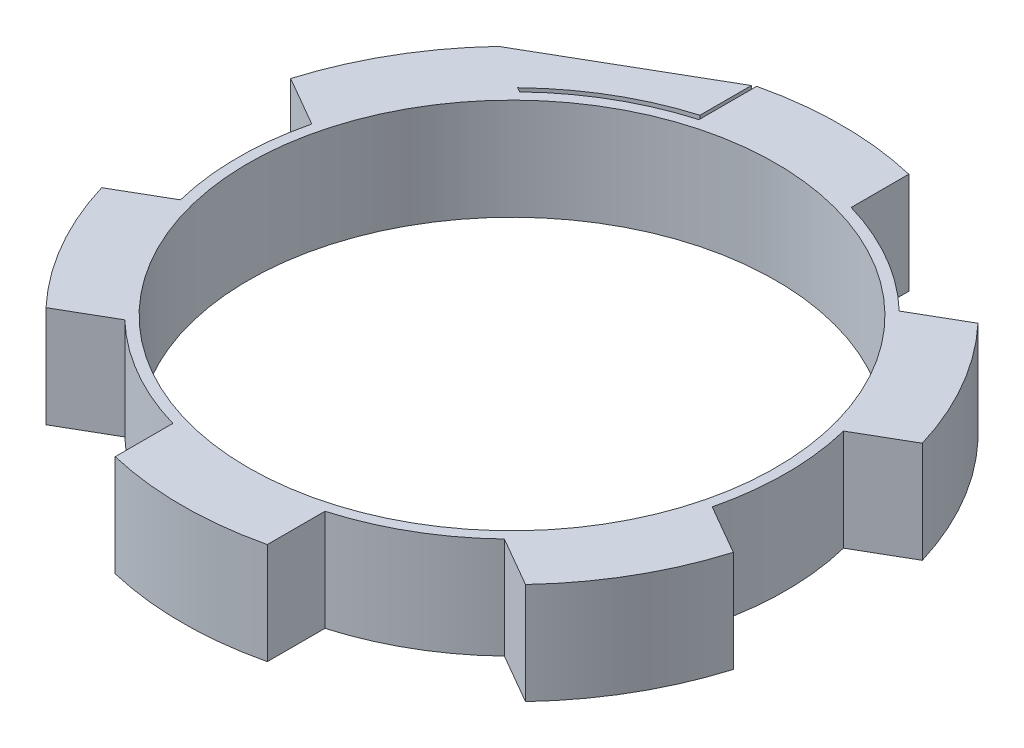
ISO-10303-21;
HEADER;
FILE_DESCRIPTION(('STEP AP214'),'2;1');
FILE_NAME('part.step','',(''),(''),'','','');
FILE_SCHEMA(('AUTOMOTIVE_DESIGN { 1 0 10303 214 1 1 1 1 }'));
ENDSEC;
DATA;
#1=APPLICATION_CONTEXT('core data for automotive mechanical design processes');
#2=APPLICATION_PROTOCOL_DEFINITION('international standard','automotive_design',2000,#1);
#3=PRODUCT_CONTEXT('',#1,'mechanical');
#4=PRODUCT('Part','Part','',(#3));
#5=PRODUCT_RELATED_PRODUCT_CATEGORY('part','',(#4));
#6=PRODUCT_DEFINITION_FORMATION('','',#4);
#7=PRODUCT_DEFINITION_CONTEXT('part definition',#1,'design');
#8=PRODUCT_DEFINITION('design','',#6,#7);
#9=PRODUCT_DEFINITION_SHAPE('','',#8);
#10=(LENGTH_UNIT() NAMED_UNIT(*) SI_UNIT(.MILLI.,.METRE.));
#11=(NAMED_UNIT(*) PLANE_ANGLE_UNIT() SI_UNIT($,.RADIAN.));
#12=(NAMED_UNIT(*) SI_UNIT($,.STERADIAN.) SOLID_ANGLE_UNIT());
#13=UNCERTAINTY_MEASURE_WITH_UNIT(LENGTH_MEASURE(1.E-05),#10,'distance_accuracy_value','');
#14=(GEOMETRIC_REPRESENTATION_CONTEXT(3) GLOBAL_UNCERTAINTY_ASSIGNED_CONTEXT((#13)) GLOBAL_UNIT_ASSIGNED_CONTEXT((#10,
#11,#12)) REPRESENTATION_CONTEXT('',''));
#15=CARTESIAN_POINT('',(0.,0.,0.));
#16=DIRECTION('',(0.,0.,1.));
#17=DIRECTION('',(1.,0.,0.));
#18=AXIS2_PLACEMENT_3D('',#15,#16,#17);
#19=CARTESIAN_POINT('',(3.75000000000008,25.,-6.49519052838325));
#20=DIRECTION('',(-0.50000000000001,0.,0.866025403784433));
#21=DIRECTION('',(0.866025403784433,0.,0.50000000000001));
#22=AXIS2_PLACEMENT_3D('',#19,#20,#21);
#23=PLANE('',#22);
#24=DIRECTION('',(0.,1.,0.));
#25=VECTOR('',#24,1.);
#26=CARTESIAN_POINT('',(-19.162878474779,15.,-19.7239470837065));
#27=LINE('',#26,#25);
#28=CARTESIAN_POINT('',(-19.162878474779,15.,-19.7239470837065));
#29=VERTEX_POINT('',#28);
#30=CARTESIAN_POINT('',(-19.162878474779,25.,-19.7239470837065));
#31=VERTEX_POINT('',#30);
#32=EDGE_CURVE('E249',#29,#31,#27,.T.);
#33=ORIENTED_EDGE('',*,*,#32,.T.);
#34=DIRECTION('',(-0.866025403784433,0.,-0.50000000000001));
#35=VECTOR('',#34,1.);
#36=CARTESIAN_POINT('',(3.75000000000008,25.,-6.49519052838325));
#37=LINE('',#36,#35);
#38=CARTESIAN_POINT('',(-18.7124686978077,25.,-19.4639028777264));
#39=VERTEX_POINT('',#38);
#40=EDGE_CURVE('E303',#39,#31,#37,.T.);
#41=ORIENTED_EDGE('',*,*,#40,.F.);
#42=DIRECTION('',(0.,-1.,0.));
#43=VECTOR('',#42,1.);
#44=CARTESIAN_POINT('',(-18.7124686978077,25.,-19.4639028777264));
#45=LINE('',#44,#43);
#46=CARTESIAN_POINT('',(-18.7124686978077,15.,-19.4639028777264));
#47=VERTEX_POINT('',#46);
#48=EDGE_CURVE('E417',#39,#47,#45,.T.);
#49=ORIENTED_EDGE('',*,*,#48,.T.);
#50=DIRECTION('',(-0.866025403784433,0.,-0.50000000000001));
#51=VECTOR('',#50,1.);
#52=CARTESIAN_POINT('',(3.75000000000008,15.,-6.49519052838325));
#53=LINE('',#52,#51);
#54=EDGE_CURVE('E302',#47,#29,#53,.T.);
#55=ORIENTED_EDGE('',*,*,#54,.T.);
#56=EDGE_LOOP('',(#33,#41,#49,#55));
#57=FACE_BOUND('',#56,.T.);
#58=ADVANCED_FACE('F47',(#57),#23,.F.);
#59=CARTESIAN_POINT('',(0.,25.,0.));
#60=DIRECTION('',(0.,-1.,0.));
#61=DIRECTION('',(0.,0.,-1.));
#62=AXIS2_PLACEMENT_3D('',#59,#60,#61);
#63=CYLINDRICAL_SURFACE('',#62,27.);
#64=DIRECTION('',(0.,-1.,0.));
#65=VECTOR('',#64,1.);
#66=CARTESIAN_POINT('',(-7.50000000000018,25.,25.9374246986858));
#67=LINE('',#66,#65);
#68=CARTESIAN_POINT('',(-7.50000000000018,25.,25.9374246986858));
#69=VERTEX_POINT('',#68);
#70=CARTESIAN_POINT('',(-7.50000000000018,15.,25.9374246986858));
#71=VERTEX_POINT('',#70);
#72=EDGE_CURVE('E11',#69,#71,#67,.T.);
#73=ORIENTED_EDGE('',*,*,#72,.F.);
#74=CARTESIAN_POINT('',(0.,25.,0.));
#75=DIRECTION('',(0.,1.,0.));
#76=DIRECTION('',(1.,0.,0.));
#77=AXIS2_PLACEMENT_3D('',#74,#75,#76);
#78=CIRCLE('',#77,27.);
#79=CARTESIAN_POINT('',(-18.7124686978081,25.,19.4639028777261));
#80=VERTEX_POINT('',#79);
#81=EDGE_CURVE('E464',#80,#69,#78,.T.);
#82=ORIENTED_EDGE('',*,*,#81,.F.);
#83=DIRECTION('',(0.,-1.,0.));
#84=VECTOR('',#83,1.);
#85=CARTESIAN_POINT('',(-18.7124686978081,25.,19.4639028777261));
#86=LINE('',#85,#84);
#87=CARTESIAN_POINT('',(-18.7124686978081,15.,19.4639028777261));
#88=VERTEX_POINT('',#87);
#89=EDGE_CURVE('E420',#80,#88,#86,.T.);
#90=ORIENTED_EDGE('',*,*,#89,.T.);
#91=CARTESIAN_POINT('',(0.,15.,0.));
#92=DIRECTION('',(0.,1.,0.));
#93=DIRECTION('',(1.,0.,0.));
#94=AXIS2_PLACEMENT_3D('',#91,#92,#93);
#95=CIRCLE('',#94,27.);
#96=EDGE_CURVE('E62',#88,#71,#95,.T.);
#97=ORIENTED_EDGE('',*,*,#96,.T.);
#98=EDGE_LOOP('',(#73,#82,#90,#97));
#99=FACE_BOUND('',#98,.T.);
#100=ADVANCED_FACE('F507',(#99),#63,.T.);
#101=DIRECTION('',(0.,-1.,0.));
#102=VECTOR('',#101,1.);
#103=CARTESIAN_POINT('',(-26.212468697808,25.,6.47352182095941));
#104=LINE('',#103,#102);
#105=CARTESIAN_POINT('',(-26.212468697808,25.,6.47352182095941));
#106=VERTEX_POINT('',#105);
#107=CARTESIAN_POINT('',(-26.212468697808,15.,6.47352182095941));
#108=VERTEX_POINT('',#107);
#109=EDGE_CURVE('E422',#106,#108,#104,.T.);
#110=ORIENTED_EDGE('',*,*,#109,.F.);
#111=CARTESIAN_POINT('',(-26.2124686978078,25.,-6.47352182095995));
#112=VERTEX_POINT('',#111);
#113=EDGE_CURVE('E461',#112,#106,#78,.T.);
#114=ORIENTED_EDGE('',*,*,#113,.F.);
#115=DIRECTION('',(0.,-1.,0.));
#116=VECTOR('',#115,1.);
#117=CARTESIAN_POINT('',(-26.2124686978078,25.,-6.47352182095995));
#118=LINE('',#117,#116);
#119=CARTESIAN_POINT('',(-26.2124686978078,15.,-6.47352182095995));
#120=VERTEX_POINT('',#119);
#121=EDGE_CURVE('E414',#112,#120,#118,.T.);
#122=ORIENTED_EDGE('',*,*,#121,.T.);
#123=EDGE_CURVE('E434',#120,#108,#95,.T.);
#124=ORIENTED_EDGE('',*,*,#123,.T.);
#125=EDGE_LOOP('',(#110,#114,#122,#124));
#126=FACE_BOUND('',#125,.T.);
#127=ADVANCED_FACE('F515',(#126),#63,.T.);
#128=ORIENTED_EDGE('',*,*,#48,.F.);
#129=CARTESIAN_POINT('',(-7.5,25.,-25.9374246986859));
#130=VERTEX_POINT('',#129);
#131=EDGE_CURVE('E460',#130,#39,#78,.T.);
#132=ORIENTED_EDGE('',*,*,#131,.F.);
#133=DIRECTION('',(0.,-1.,0.));
#134=VECTOR('',#133,1.);
#135=CARTESIAN_POINT('',(-7.5,25.,-25.9374246986859));
#136=LINE('',#135,#134);
#137=CARTESIAN_POINT('',(-7.5,15.,-25.9374246986859));
#138=VERTEX_POINT('',#137);
#139=EDGE_CURVE('E408',#130,#138,#136,.T.);
#140=ORIENTED_EDGE('',*,*,#139,.T.);
#141=EDGE_CURVE('E435',#138,#47,#95,.T.);
#142=ORIENTED_EDGE('',*,*,#141,.T.);
#143=EDGE_LOOP('',(#128,#132,#140,#142));
#144=FACE_BOUND('',#143,.T.);
#145=ADVANCED_FACE('F691',(#144),#63,.T.);
#146=DIRECTION('',(0.,-1.,0.));
#147=VECTOR('',#146,1.);
#148=CARTESIAN_POINT('',(7.5,25.,-25.9374246986859));
#149=LINE('',#148,#147);
#150=CARTESIAN_POINT('',(7.5,25.,-25.9374246986859));
#151=VERTEX_POINT('',#150);
#152=CARTESIAN_POINT('',(7.5,15.,-25.9374246986859));
#153=VERTEX_POINT('',#152);
#154=EDGE_CURVE('E411',#151,#153,#149,.T.);
#155=ORIENTED_EDGE('',*,*,#154,.F.);
#156=CARTESIAN_POINT('',(18.712468697808,25.,-19.4639028777262));
#157=VERTEX_POINT('',#156);
#158=EDGE_CURVE('E368',#157,#151,#78,.T.);
#159=ORIENTED_EDGE('',*,*,#158,.F.);
#160=DIRECTION('',(0.,-1.,0.));
#161=VECTOR('',#160,1.);
#162=CARTESIAN_POINT('',(18.712468697808,25.,-19.4639028777262));
#163=LINE('',#162,#161);
#164=CARTESIAN_POINT('',(18.712468697808,15.,-19.4639028777262));
#165=VERTEX_POINT('',#164);
#166=EDGE_CURVE('E402',#157,#165,#163,.T.);
#167=ORIENTED_EDGE('',*,*,#166,.T.);
#168=EDGE_CURVE('E371',#165,#153,#95,.T.);
#169=ORIENTED_EDGE('',*,*,#168,.T.);
#170=EDGE_LOOP('',(#155,#159,#167,#169));
#171=FACE_BOUND('',#170,.T.);
#172=ADVANCED_FACE('F439',(#171),#63,.T.);
#173=DIRECTION('',(0.,-1.,0.));
#174=VECTOR('',#173,1.);
#175=CARTESIAN_POINT('',(26.2124686978079,25.,-6.47352182095959));
#176=LINE('',#175,#174);
#177=CARTESIAN_POINT('',(26.2124686978079,25.,-6.47352182095959));
#178=VERTEX_POINT('',#177);
#179=CARTESIAN_POINT('',(26.2124686978079,15.,-6.47352182095959));
#180=VERTEX_POINT('',#179);
#181=EDGE_CURVE('E405',#178,#180,#176,.T.);
#182=ORIENTED_EDGE('',*,*,#181,.F.);
#183=CARTESIAN_POINT('',(26.2124686978079,25.,6.47352182095977));
#184=VERTEX_POINT('',#183);
#185=EDGE_CURVE('E364',#184,#178,#78,.T.);
#186=ORIENTED_EDGE('',*,*,#185,.F.);
#187=DIRECTION('',(0.,-1.,0.));
#188=VECTOR('',#187,1.);
#189=CARTESIAN_POINT('',(26.2124686978079,25.,6.47352182095977));
#190=LINE('',#189,#188);
#191=CARTESIAN_POINT('',(26.2124686978079,15.,6.47352182095977));
#192=VERTEX_POINT('',#191);
#193=EDGE_CURVE('E367',#192,#184,#190,.F.);
#194=ORIENTED_EDGE('',*,*,#193,.F.);
#195=EDGE_CURVE('E369',#192,#180,#95,.T.);
#196=ORIENTED_EDGE('',*,*,#195,.T.);
#197=EDGE_LOOP('',(#182,#186,#194,#196));
#198=FACE_BOUND('',#197,.T.);
#199=ADVANCED_FACE('F484',(#198),#63,.T.);
#200=CARTESIAN_POINT('',(-3.75000000000003,25.,6.49519052838327));
#201=DIRECTION('',(0.500000000000004,0.,-0.866025403784436));
#202=DIRECTION('',(-0.866025403784436,0.,-0.500000000000004));
#203=AXIS2_PLACEMENT_3D('',#200,#201,#202);
#204=PLANE('',#203);
#205=DIRECTION('',(0.,-1.,0.));
#206=VECTOR('',#205,1.);
#207=CARTESIAN_POINT('',(18.7124686978078,25.,19.4639028777263));
#208=LINE('',#207,#206);
#209=CARTESIAN_POINT('',(18.7124686978078,15.,19.4639028777263));
#210=VERTEX_POINT('',#209);
#211=CARTESIAN_POINT('',(18.7124686978078,25.,19.4639028777263));
#212=VERTEX_POINT('',#211);
#213=EDGE_CURVE('E374',#210,#212,#208,.F.);
#214=ORIENTED_EDGE('',*,*,#213,.F.);
#215=DIRECTION('',(0.866025403784436,0.,0.500000000000004));
#216=VECTOR('',#215,1.);
#217=CARTESIAN_POINT('',(-3.75000000000003,15.,6.49519052838327));
#218=LINE('',#217,#216);
#219=CARTESIAN_POINT('',(23.6361278752582,15.,22.3065788292253));
#220=VERTEX_POINT('',#219);
#221=EDGE_CURVE('E391',#210,#220,#218,.T.);
#222=ORIENTED_EDGE('',*,*,#221,.T.);
#223=DIRECTION('',(0.,-1.,0.));
#224=VECTOR('',#223,1.);
#225=CARTESIAN_POINT('',(23.6361278752582,25.,22.3065788292253));
#226=LINE('',#225,#224);
#227=CARTESIAN_POINT('',(23.6361278752582,25.,22.3065788292253));
#228=VERTEX_POINT('',#227);
#229=EDGE_CURVE('E399',#228,#220,#226,.T.);
#230=ORIENTED_EDGE('',*,*,#229,.F.);
#231=DIRECTION('',(0.866025403784436,0.,0.500000000000004));
#232=VECTOR('',#231,1.);
#233=CARTESIAN_POINT('',(-3.75000000000003,25.,6.49519052838327));
#234=LINE('',#233,#232);
#235=EDGE_CURVE('E380',#212,#228,#234,.T.);
#236=ORIENTED_EDGE('',*,*,#235,.F.);
#237=EDGE_LOOP('',(#214,#222,#230,#236));
#238=FACE_BOUND('',#237,.T.);
#239=ADVANCED_FACE('F472',(#238),#204,.F.);
#240=CARTESIAN_POINT('',(3.75000000000003,25.,-6.49519052838327));
#241=DIRECTION('',(0.500000000000004,0.,-0.866025403784436));
#242=DIRECTION('',(-0.866025403784436,0.,-0.500000000000004));
#243=AXIS2_PLACEMENT_3D('',#240,#241,#242);
#244=PLANE('',#243);
#245=DIRECTION('',(0.866025403784436,0.,0.500000000000004));
#246=VECTOR('',#245,1.);
#247=CARTESIAN_POINT('',(3.75000000000003,15.,-6.49519052838327));
#248=LINE('',#247,#246);
#249=CARTESIAN_POINT('',(31.1361278752583,15.,9.31619777245874));
#250=VERTEX_POINT('',#249);
#251=EDGE_CURVE('E381',#192,#250,#248,.T.);
#252=ORIENTED_EDGE('',*,*,#251,.F.);
#253=ORIENTED_EDGE('',*,*,#193,.T.);
#254=DIRECTION('',(0.866025403784436,0.,0.500000000000004));
#255=VECTOR('',#254,1.);
#256=CARTESIAN_POINT('',(3.75000000000003,25.,-6.49519052838327));
#257=LINE('',#256,#255);
#258=CARTESIAN_POINT('',(31.1361278752583,25.,9.31619777245874));
#259=VERTEX_POINT('',#258);
#260=EDGE_CURVE('E386',#184,#259,#257,.T.);
#261=ORIENTED_EDGE('',*,*,#260,.T.);
#262=DIRECTION('',(0.,-1.,0.));
#263=VECTOR('',#262,1.);
#264=CARTESIAN_POINT('',(31.1361278752583,25.,9.31619777245874));
#265=LINE('',#264,#263);
#266=EDGE_CURVE('E388',#259,#250,#265,.T.);
#267=ORIENTED_EDGE('',*,*,#266,.T.);
#268=EDGE_LOOP('',(#252,#253,#261,#267));
#269=FACE_BOUND('',#268,.T.);
#270=ADVANCED_FACE('F481',(#269),#244,.T.);
#271=CARTESIAN_POINT('',(0.,25.,0.));
#272=DIRECTION('',(0.,-1.,0.));
#273=DIRECTION('',(0.,0.,-1.));
#274=AXIS2_PLACEMENT_3D('',#271,#272,#273);
#275=CYLINDRICAL_SURFACE('',#274,26.);
#276=CARTESIAN_POINT('',(0.,15.,0.));
#277=DIRECTION('',(0.,1.,0.));
#278=DIRECTION('',(0.,0.,1.));
#279=AXIS2_PLACEMENT_3D('',#276,#277,#278);
#280=CIRCLE('',#279,26.);
#281=CARTESIAN_POINT('',(0.,15.,26.));
#282=VERTEX_POINT('',#281);
#283=EDGE_CURVE('E376',#282,#282,#280,.T.);
#284=ORIENTED_EDGE('',*,*,#283,.F.);
#285=EDGE_LOOP('',(#284));
#286=FACE_BOUND('',#285,.T.);
#287=CARTESIAN_POINT('',(0.,25.,0.));
#288=DIRECTION('',(0.,1.,0.));
#289=DIRECTION('',(0.,0.,1.));
#290=AXIS2_PLACEMENT_3D('',#287,#288,#289);
#291=CIRCLE('',#290,26.);
#292=CARTESIAN_POINT('',(0.,25.,26.));
#293=VERTEX_POINT('',#292);
#294=EDGE_CURVE('E377',#293,#293,#291,.T.);
#295=ORIENTED_EDGE('',*,*,#294,.T.);
#296=EDGE_LOOP('',(#295));
#297=FACE_BOUND('',#296,.T.);
#298=ADVANCED_FACE('F49',(#286,#297),#275,.F.);
#299=CARTESIAN_POINT('',(0.,25.,0.));
#300=DIRECTION('',(0.,-1.,0.));
#301=DIRECTION('',(0.,0.,-1.));
#302=AXIS2_PLACEMENT_3D('',#299,#300,#301);
#303=CYLINDRICAL_SURFACE('',#302,32.5);
#304=CARTESIAN_POINT('',(0.,15.,0.));
#305=DIRECTION('',(0.,1.,0.));
#306=DIRECTION('',(0.,0.,1.));
#307=AXIS2_PLACEMENT_3D('',#304,#305,#306);
#308=CIRCLE('',#307,32.5);
#309=EDGE_CURVE('E393',#220,#250,#308,.T.);
#310=ORIENTED_EDGE('',*,*,#309,.T.);
#311=ORIENTED_EDGE('',*,*,#266,.F.);
#312=CARTESIAN_POINT('',(0.,25.,0.));
#313=DIRECTION('',(0.,1.,0.));
#314=DIRECTION('',(0.,0.,1.));
#315=AXIS2_PLACEMENT_3D('',#312,#313,#314);
#316=CIRCLE('',#315,32.5);
#317=EDGE_CURVE('E383',#228,#259,#316,.T.);
#318=ORIENTED_EDGE('',*,*,#317,.F.);
#319=ORIENTED_EDGE('',*,*,#229,.T.);
#320=EDGE_LOOP('',(#310,#311,#318,#319));
#321=FACE_BOUND('',#320,.T.);
#322=ADVANCED_FACE('F476',(#321),#303,.T.);
#323=CARTESIAN_POINT('',(0.,25.,0.));
#324=DIRECTION('',(0.,1.,0.));
#325=DIRECTION('',(0.,0.,1.));
#326=AXIS2_PLACEMENT_3D('',#323,#324,#325);
#327=PLANE('',#326);
#328=ORIENTED_EDGE('',*,*,#294,.F.);
#329=EDGE_LOOP('',(#328));
#330=FACE_BOUND('',#329,.T.);
#331=ORIENTED_EDGE('',*,*,#81,.T.);
#332=DIRECTION('',(0.,0.,1.));
#333=VECTOR('',#332,1.);
#334=CARTESIAN_POINT('',(-7.5,25.,0.));
#335=LINE('',#334,#333);
#336=CARTESIAN_POINT('',(-7.50000000000022,25.,31.6227766016837));
#337=VERTEX_POINT('',#336);
#338=EDGE_CURVE('E263',#69,#337,#335,.T.);
#339=ORIENTED_EDGE('',*,*,#338,.T.);
#340=CARTESIAN_POINT('',(0.,25.,0.));
#341=DIRECTION('',(0.,1.,0.));
#342=DIRECTION('',(0.,0.,1.));
#343=AXIS2_PLACEMENT_3D('',#340,#341,#342);
#344=CIRCLE('',#343,32.5);
#345=CARTESIAN_POINT('',(7.49999999999978,25.,31.6227766016838));
#346=VERTEX_POINT('',#345);
#347=EDGE_CURVE('E265',#337,#346,#344,.T.);
#348=ORIENTED_EDGE('',*,*,#347,.T.);
#349=DIRECTION('',(0.,0.,1.));
#350=VECTOR('',#349,1.);
#351=CARTESIAN_POINT('',(7.5,25.,0.));
#352=LINE('',#351,#350);
#353=CARTESIAN_POINT('',(7.49999999999982,25.,25.9374246986859));
#354=VERTEX_POINT('',#353);
#355=EDGE_CURVE('E269',#354,#346,#352,.T.);
#356=ORIENTED_EDGE('',*,*,#355,.F.);
#357=EDGE_CURVE('E69',#354,#212,#78,.T.);
#358=ORIENTED_EDGE('',*,*,#357,.T.);
#359=ORIENTED_EDGE('',*,*,#235,.T.);
#360=ORIENTED_EDGE('',*,*,#317,.T.);
#361=ORIENTED_EDGE('',*,*,#260,.F.);
#362=ORIENTED_EDGE('',*,*,#185,.T.);
#363=DIRECTION('',(0.86602540378444,0.,-0.499999999999998));
#364=VECTOR('',#363,1.);
#365=CARTESIAN_POINT('',(3.74999999999999,25.,6.4951905283833));
#366=LINE('',#365,#364);
#367=CARTESIAN_POINT('',(31.1361278752583,25.,-9.31619777245853));
#368=VERTEX_POINT('',#367);
#369=EDGE_CURVE('E344',#178,#368,#366,.T.);
#370=ORIENTED_EDGE('',*,*,#369,.T.);
#371=CARTESIAN_POINT('',(0.,25.,0.));
#372=DIRECTION('',(0.,1.,0.));
#373=DIRECTION('',(0.,0.,1.));
#374=AXIS2_PLACEMENT_3D('',#371,#372,#373);
#375=CIRCLE('',#374,32.5);
#376=CARTESIAN_POINT('',(23.6361278752584,25.,-22.3065788292251));
#377=VERTEX_POINT('',#376);
#378=EDGE_CURVE('E346',#368,#377,#375,.T.);
#379=ORIENTED_EDGE('',*,*,#378,.T.);
#380=DIRECTION('',(0.86602540378444,0.,-0.499999999999998));
#381=VECTOR('',#380,1.);
#382=CARTESIAN_POINT('',(-3.74999999999998,25.,-6.4951905283833));
#383=LINE('',#382,#381);
#384=EDGE_CURVE('E350',#157,#377,#383,.T.);
#385=ORIENTED_EDGE('',*,*,#384,.F.);
#386=ORIENTED_EDGE('',*,*,#158,.T.);
#387=DIRECTION('',(0.,0.,-1.));
#388=VECTOR('',#387,1.);
#389=CARTESIAN_POINT('',(7.5,25.,0.));
#390=LINE('',#389,#388);
#391=CARTESIAN_POINT('',(7.5,25.,-31.6227766016838));
#392=VERTEX_POINT('',#391);
#393=EDGE_CURVE('E324',#151,#392,#390,.T.);
#394=ORIENTED_EDGE('',*,*,#393,.T.);
#395=CARTESIAN_POINT('',(0.,25.,0.));
#396=DIRECTION('',(0.,1.,0.));
#397=DIRECTION('',(0.,0.,1.));
#398=AXIS2_PLACEMENT_3D('',#395,#396,#397);
#399=CIRCLE('',#398,32.5);
#400=CARTESIAN_POINT('',(-7.5,25.,-31.6227766016838));
#401=VERTEX_POINT('',#400);
#402=EDGE_CURVE('E326',#392,#401,#399,.T.);
#403=ORIENTED_EDGE('',*,*,#402,.T.);
#404=DIRECTION('',(0.,0.,-1.));
#405=VECTOR('',#404,1.);
#406=CARTESIAN_POINT('',(-7.5,25.,0.));
#407=LINE('',#406,#405);
#408=EDGE_CURVE('E330',#130,#401,#407,.T.);
#409=ORIENTED_EDGE('',*,*,#408,.F.);
#410=ORIENTED_EDGE('',*,*,#131,.T.);
#411=ORIENTED_EDGE('',*,*,#40,.T.);
#412=CARTESIAN_POINT('',(0.,25.,0.));
#413=DIRECTION('',(0.,1.,0.));
#414=DIRECTION('',(0.,0.,1.));
#415=AXIS2_PLACEMENT_3D('',#412,#413,#414);
#416=CIRCLE('',#415,27.5);
#417=CARTESIAN_POINT('',(-7.83047004738455,25.,-26.3615959083856));
#418=VERTEX_POINT('',#417);
#419=EDGE_CURVE('E257',#418,#31,#416,.T.);
#420=ORIENTED_EDGE('',*,*,#419,.F.);
#421=DIRECTION('',(-6.625787958738E-05,0.,0.999999997804947));
#422=VECTOR('',#421,1.);
#423=CARTESIAN_POINT('',(-7.83221667645154,25.,-0.00051894607058971));
#424=LINE('',#423,#422);
#425=CARTESIAN_POINT('',(-7.83013408165763,25.,-31.4321736007701));
#426=VERTEX_POINT('',#425);
#427=EDGE_CURVE('E242',#426,#418,#424,.T.);
#428=ORIENTED_EDGE('',*,*,#427,.F.);
#429=DIRECTION('',(-0.866025403784442,0.,0.499999999999995));
#430=VECTOR('',#429,1.);
#431=CARTESIAN_POINT('',(-15.568063937629,25.,-26.9646777154546));
#432=LINE('',#431,#430);
#433=CARTESIAN_POINT('',(-23.636127875258,25.,-22.3065788292255));
#434=VERTEX_POINT('',#433);
#435=EDGE_CURVE('E251',#426,#434,#432,.T.);
#436=ORIENTED_EDGE('',*,*,#435,.T.);
#437=CARTESIAN_POINT('',(0.,25.,0.));
#438=DIRECTION('',(0.,1.,0.));
#439=DIRECTION('',(0.,0.,1.));
#440=AXIS2_PLACEMENT_3D('',#437,#438,#439);
#441=CIRCLE('',#440,32.5);
#442=CARTESIAN_POINT('',(-31.1361278752582,25.,-9.31619777245897));
#443=VERTEX_POINT('',#442);
#444=EDGE_CURVE('E306',#434,#443,#441,.T.);
#445=ORIENTED_EDGE('',*,*,#444,.T.);
#446=DIRECTION('',(-0.866025403784433,0.,-0.50000000000001));
#447=VECTOR('',#446,1.);
#448=CARTESIAN_POINT('',(-3.75000000000008,25.,6.49519052838325));
#449=LINE('',#448,#447);
#450=EDGE_CURVE('E310',#112,#443,#449,.T.);
#451=ORIENTED_EDGE('',*,*,#450,.F.);
#452=ORIENTED_EDGE('',*,*,#113,.T.);
#453=DIRECTION('',(-0.866025403784443,0.,0.499999999999992));
#454=VECTOR('',#453,1.);
#455=CARTESIAN_POINT('',(-3.74999999999994,25.,-6.49519052838332));
#456=LINE('',#455,#454);
#457=CARTESIAN_POINT('',(-31.1361278752584,25.,9.31619777245832));
#458=VERTEX_POINT('',#457);
#459=EDGE_CURVE('E283',#106,#458,#456,.T.);
#460=ORIENTED_EDGE('',*,*,#459,.T.);
#461=CARTESIAN_POINT('',(0.,25.,0.));
#462=DIRECTION('',(0.,1.,0.));
#463=DIRECTION('',(0.,0.,1.));
#464=AXIS2_PLACEMENT_3D('',#461,#462,#463);
#465=CIRCLE('',#464,32.5);
#466=CARTESIAN_POINT('',(-23.6361278752585,25.,22.306578829225));
#467=VERTEX_POINT('',#466);
#468=EDGE_CURVE('E285',#458,#467,#465,.T.);
#469=ORIENTED_EDGE('',*,*,#468,.T.);
#470=DIRECTION('',(-0.866025403784443,0.,0.499999999999992));
#471=VECTOR('',#470,1.);
#472=CARTESIAN_POINT('',(3.74999999999994,25.,6.49519052838333));
#473=LINE('',#472,#471);
#474=EDGE_CURVE('E289',#80,#467,#473,.T.);
#475=ORIENTED_EDGE('',*,*,#474,.F.);
#476=EDGE_LOOP('',(#331,#339,#348,#356,#358,#359,#360,#361,#362,#370,#379,#385,#386,#394,#403,
#409,#410,#411,#420,#428,#436,#445,#451,#452,#460,#469,#475));
#477=FACE_BOUND('',#476,.T.);
#478=ADVANCED_FACE('F457',(#330,#477),#327,.T.);
#479=CARTESIAN_POINT('',(0.,15.,0.));
#480=DIRECTION('',(0.,1.,0.));
#481=DIRECTION('',(0.,0.,1.));
#482=AXIS2_PLACEMENT_3D('',#479,#480,#481);
#483=PLANE('',#482);
#484=ORIENTED_EDGE('',*,*,#283,.T.);
#485=EDGE_LOOP('',(#484));
#486=FACE_BOUND('',#485,.T.);
#487=DIRECTION('',(0.,0.,1.));
#488=VECTOR('',#487,1.);
#489=CARTESIAN_POINT('',(-7.5,15.,0.));
#490=LINE('',#489,#488);
#491=CARTESIAN_POINT('',(-7.50000000000022,15.,31.6227766016837));
#492=VERTEX_POINT('',#491);
#493=EDGE_CURVE('E261',#71,#492,#490,.T.);
#494=ORIENTED_EDGE('',*,*,#493,.F.);
#495=ORIENTED_EDGE('',*,*,#96,.F.);
#496=DIRECTION('',(-0.866025403784443,0.,0.499999999999992));
#497=VECTOR('',#496,1.);
#498=CARTESIAN_POINT('',(3.74999999999994,15.,6.49519052838333));
#499=LINE('',#498,#497);
#500=CARTESIAN_POINT('',(-23.6361278752585,15.,22.306578829225));
#501=VERTEX_POINT('',#500);
#502=EDGE_CURVE('E286',#88,#501,#499,.T.);
#503=ORIENTED_EDGE('',*,*,#502,.T.);
#504=CARTESIAN_POINT('',(0.,15.,0.));
#505=DIRECTION('',(0.,1.,0.));
#506=DIRECTION('',(0.,0.,1.));
#507=AXIS2_PLACEMENT_3D('',#504,#505,#506);
#508=CIRCLE('',#507,32.5);
#509=CARTESIAN_POINT('',(-31.1361278752584,15.,9.31619777245832));
#510=VERTEX_POINT('',#509);
#511=EDGE_CURVE('E293',#510,#501,#508,.T.);
#512=ORIENTED_EDGE('',*,*,#511,.F.);
#513=DIRECTION('',(-0.866025403784443,0.,0.499999999999992));
#514=VECTOR('',#513,1.);
#515=CARTESIAN_POINT('',(-3.74999999999994,15.,-6.49519052838332));
#516=LINE('',#515,#514);
#517=EDGE_CURVE('E282',#108,#510,#516,.T.);
#518=ORIENTED_EDGE('',*,*,#517,.F.);
#519=ORIENTED_EDGE('',*,*,#123,.F.);
#520=DIRECTION('',(-0.866025403784433,0.,-0.50000000000001));
#521=VECTOR('',#520,1.);
#522=CARTESIAN_POINT('',(-3.75000000000008,15.,6.49519052838325));
#523=LINE('',#522,#521);
#524=CARTESIAN_POINT('',(-31.1361278752582,15.,-9.31619777245897));
#525=VERTEX_POINT('',#524);
#526=EDGE_CURVE('E307',#120,#525,#523,.T.);
#527=ORIENTED_EDGE('',*,*,#526,.T.);
#528=CARTESIAN_POINT('',(0.,15.,0.));
#529=DIRECTION('',(0.,1.,0.));
#530=DIRECTION('',(0.,0.,1.));
#531=AXIS2_PLACEMENT_3D('',#528,#529,#530);
#532=CIRCLE('',#531,32.5);
#533=CARTESIAN_POINT('',(-23.636127875258,15.,-22.3065788292255));
#534=VERTEX_POINT('',#533);
#535=EDGE_CURVE('E314',#534,#525,#532,.T.);
#536=ORIENTED_EDGE('',*,*,#535,.F.);
#537=DIRECTION('',(-0.866025403784442,0.,0.499999999999995));
#538=VECTOR('',#537,1.);
#539=CARTESIAN_POINT('',(-15.568063937629,15.,-26.9646777154546));
#540=LINE('',#539,#538);
#541=CARTESIAN_POINT('',(-7.83013408165763,15.,-31.4321736007701));
#542=VERTEX_POINT('',#541);
#543=EDGE_CURVE('E235',#542,#534,#540,.T.);
#544=ORIENTED_EDGE('',*,*,#543,.F.);
#545=DIRECTION('',(-6.625787958738E-05,0.,0.999999997804947));
#546=VECTOR('',#545,1.);
#547=CARTESIAN_POINT('',(-7.83221667645154,15.,-0.00051894607058971));
#548=LINE('',#547,#546);
#549=CARTESIAN_POINT('',(-7.83047004738455,15.,-26.3615959083856));
#550=VERTEX_POINT('',#549);
#551=EDGE_CURVE('E226',#542,#550,#548,.T.);
#552=ORIENTED_EDGE('',*,*,#551,.T.);
#553=CARTESIAN_POINT('',(0.,15.,0.));
#554=DIRECTION('',(0.,1.,0.));
#555=DIRECTION('',(0.,0.,1.));
#556=AXIS2_PLACEMENT_3D('',#553,#554,#555);
#557=CIRCLE('',#556,27.5);
#558=EDGE_CURVE('E232',#550,#29,#557,.T.);
#559=ORIENTED_EDGE('',*,*,#558,.T.);
#560=ORIENTED_EDGE('',*,*,#54,.F.);
#561=ORIENTED_EDGE('',*,*,#141,.F.);
#562=DIRECTION('',(0.,0.,-1.));
#563=VECTOR('',#562,1.);
#564=CARTESIAN_POINT('',(-7.5,15.,0.));
#565=LINE('',#564,#563);
#566=CARTESIAN_POINT('',(-7.5,15.,-31.6227766016838));
#567=VERTEX_POINT('',#566);
#568=EDGE_CURVE('E327',#138,#567,#565,.T.);
#569=ORIENTED_EDGE('',*,*,#568,.T.);
#570=CARTESIAN_POINT('',(0.,15.,0.));
#571=DIRECTION('',(0.,1.,0.));
#572=DIRECTION('',(0.,0.,1.));
#573=AXIS2_PLACEMENT_3D('',#570,#571,#572);
#574=CIRCLE('',#573,32.5);
#575=CARTESIAN_POINT('',(7.5,15.,-31.6227766016838));
#576=VERTEX_POINT('',#575);
#577=EDGE_CURVE('E334',#576,#567,#574,.T.);
#578=ORIENTED_EDGE('',*,*,#577,.F.);
#579=DIRECTION('',(0.,0.,-1.));
#580=VECTOR('',#579,1.);
#581=CARTESIAN_POINT('',(7.5,15.,0.));
#582=LINE('',#581,#580);
#583=EDGE_CURVE('E323',#153,#576,#582,.T.);
#584=ORIENTED_EDGE('',*,*,#583,.F.);
#585=ORIENTED_EDGE('',*,*,#168,.F.);
#586=DIRECTION('',(0.86602540378444,0.,-0.499999999999998));
#587=VECTOR('',#586,1.);
#588=CARTESIAN_POINT('',(-3.74999999999998,15.,-6.4951905283833));
#589=LINE('',#588,#587);
#590=CARTESIAN_POINT('',(23.6361278752584,15.,-22.3065788292251));
#591=VERTEX_POINT('',#590);
#592=EDGE_CURVE('E347',#165,#591,#589,.T.);
#593=ORIENTED_EDGE('',*,*,#592,.T.);
#594=CARTESIAN_POINT('',(0.,15.,0.));
#595=DIRECTION('',(0.,1.,0.));
#596=DIRECTION('',(0.,0.,1.));
#597=AXIS2_PLACEMENT_3D('',#594,#595,#596);
#598=CIRCLE('',#597,32.5);
#599=CARTESIAN_POINT('',(31.1361278752583,15.,-9.31619777245853));
#600=VERTEX_POINT('',#599);
#601=EDGE_CURVE('E354',#600,#591,#598,.T.);
#602=ORIENTED_EDGE('',*,*,#601,.F.);
#603=DIRECTION('',(0.86602540378444,0.,-0.499999999999998));
#604=VECTOR('',#603,1.);
#605=CARTESIAN_POINT('',(3.74999999999999,15.,6.4951905283833));
#606=LINE('',#605,#604);
#607=EDGE_CURVE('E343',#180,#600,#606,.T.);
#608=ORIENTED_EDGE('',*,*,#607,.F.);
#609=ORIENTED_EDGE('',*,*,#195,.F.);
#610=ORIENTED_EDGE('',*,*,#251,.T.);
#611=ORIENTED_EDGE('',*,*,#309,.F.);
#612=ORIENTED_EDGE('',*,*,#221,.F.);
#613=CARTESIAN_POINT('',(7.49999999999982,15.,25.9374246986859));
#614=VERTEX_POINT('',#613);
#615=EDGE_CURVE('E363',#614,#210,#95,.T.);
#616=ORIENTED_EDGE('',*,*,#615,.F.);
#617=DIRECTION('',(0.,0.,1.));
#618=VECTOR('',#617,1.);
#619=CARTESIAN_POINT('',(7.5,15.,0.));
#620=LINE('',#619,#618);
#621=CARTESIAN_POINT('',(7.49999999999978,15.,31.6227766016838));
#622=VERTEX_POINT('',#621);
#623=EDGE_CURVE('E266',#614,#622,#620,.T.);
#624=ORIENTED_EDGE('',*,*,#623,.T.);
#625=CARTESIAN_POINT('',(0.,15.,0.));
#626=DIRECTION('',(0.,1.,0.));
#627=DIRECTION('',(0.,0.,1.));
#628=AXIS2_PLACEMENT_3D('',#625,#626,#627);
#629=CIRCLE('',#628,32.5);
#630=EDGE_CURVE('E273',#492,#622,#629,.T.);
#631=ORIENTED_EDGE('',*,*,#630,.F.);
#632=EDGE_LOOP('',(#494,#495,#503,#512,#518,#519,#527,#536,#544,#552,#559,#560,#561,#569,#578,
#584,#585,#593,#602,#608,#609,#610,#611,#612,#616,#624,#631));
#633=FACE_BOUND('',#632,.T.);
#634=ADVANCED_FACE('F229',(#486,#633),#483,.F.);
#635=ORIENTED_EDGE('',*,*,#357,.F.);
#636=DIRECTION('',(0.,-1.,0.));
#637=VECTOR('',#636,1.);
#638=CARTESIAN_POINT('',(7.49999999999982,25.,25.9374246986859));
#639=LINE('',#638,#637);
#640=EDGE_CURVE('E55',#354,#614,#639,.T.);
#641=ORIENTED_EDGE('',*,*,#640,.T.);
#642=ORIENTED_EDGE('',*,*,#615,.T.);
#643=ORIENTED_EDGE('',*,*,#213,.T.);
#644=EDGE_LOOP('',(#635,#641,#642,#643));
#645=FACE_BOUND('',#644,.T.);
#646=ADVANCED_FACE('F425',(#645),#63,.T.);
#647=CARTESIAN_POINT('',(3.74999999999999,25.,6.4951905283833));
#648=DIRECTION('',(-0.499999999999998,0.,-0.86602540378444));
#649=DIRECTION('',(-0.86602540378444,0.,0.499999999999998));
#650=AXIS2_PLACEMENT_3D('',#647,#648,#649);
#651=PLANE('',#650);
#652=ORIENTED_EDGE('',*,*,#369,.F.);
#653=ORIENTED_EDGE('',*,*,#181,.T.);
#654=ORIENTED_EDGE('',*,*,#607,.T.);
#655=DIRECTION('',(0.,-1.,0.));
#656=VECTOR('',#655,1.);
#657=CARTESIAN_POINT('',(31.1361278752583,25.,-9.31619777245853));
#658=LINE('',#657,#656);
#659=EDGE_CURVE('E360',#368,#600,#658,.T.);
#660=ORIENTED_EDGE('',*,*,#659,.F.);
#661=EDGE_LOOP('',(#652,#653,#654,#660));
#662=FACE_BOUND('',#661,.T.);
#663=ADVANCED_FACE('F489',(#662),#651,.F.);
#664=CARTESIAN_POINT('',(-3.74999999999998,25.,-6.4951905283833));
#665=DIRECTION('',(-0.499999999999998,0.,-0.86602540378444));
#666=DIRECTION('',(-0.86602540378444,0.,0.499999999999998));
#667=AXIS2_PLACEMENT_3D('',#664,#665,#666);
#668=PLANE('',#667);
#669=ORIENTED_EDGE('',*,*,#166,.F.);
#670=ORIENTED_EDGE('',*,*,#384,.T.);
#671=DIRECTION('',(0.,-1.,0.));
#672=VECTOR('',#671,1.);
#673=CARTESIAN_POINT('',(23.6361278752584,25.,-22.3065788292251));
#674=LINE('',#673,#672);
#675=EDGE_CURVE('E352',#377,#591,#674,.T.);
#676=ORIENTED_EDGE('',*,*,#675,.T.);
#677=ORIENTED_EDGE('',*,*,#592,.F.);
#678=EDGE_LOOP('',(#669,#670,#676,#677));
#679=FACE_BOUND('',#678,.T.);
#680=ADVANCED_FACE('F495',(#679),#668,.T.);
#681=CARTESIAN_POINT('',(0.,25.,0.));
#682=DIRECTION('',(0.,-1.,0.));
#683=DIRECTION('',(0.,0.,-1.));
#684=AXIS2_PLACEMENT_3D('',#681,#682,#683);
#685=CYLINDRICAL_SURFACE('',#684,32.5);
#686=ORIENTED_EDGE('',*,*,#601,.T.);
#687=ORIENTED_EDGE('',*,*,#675,.F.);
#688=ORIENTED_EDGE('',*,*,#378,.F.);
#689=ORIENTED_EDGE('',*,*,#659,.T.);
#690=EDGE_LOOP('',(#686,#687,#688,#689));
#691=FACE_BOUND('',#690,.T.);
#692=ADVANCED_FACE('F492',(#691),#685,.T.);
#693=CARTESIAN_POINT('',(7.5,25.,0.));
#694=DIRECTION('',(-1.,0.,0.));
#695=DIRECTION('',(0.,0.,1.));
#696=AXIS2_PLACEMENT_3D('',#693,#694,#695);
#697=PLANE('',#696);
#698=ORIENTED_EDGE('',*,*,#393,.F.);
#699=ORIENTED_EDGE('',*,*,#154,.T.);
#700=ORIENTED_EDGE('',*,*,#583,.T.);
#701=DIRECTION('',(0.,-1.,0.));
#702=VECTOR('',#701,1.);
#703=CARTESIAN_POINT('',(7.5,25.,-31.6227766016838));
#704=LINE('',#703,#702);
#705=EDGE_CURVE('E340',#392,#576,#704,.T.);
#706=ORIENTED_EDGE('',*,*,#705,.F.);
#707=EDGE_LOOP('',(#698,#699,#700,#706));
#708=FACE_BOUND('',#707,.T.);
#709=ADVANCED_FACE('F446',(#708),#697,.F.);
#710=CARTESIAN_POINT('',(-7.5,25.,0.));
#711=DIRECTION('',(-1.,0.,0.));
#712=DIRECTION('',(0.,0.,1.));
#713=AXIS2_PLACEMENT_3D('',#710,#711,#712);
#714=PLANE('',#713);
#715=ORIENTED_EDGE('',*,*,#139,.F.);
#716=ORIENTED_EDGE('',*,*,#408,.T.);
#717=DIRECTION('',(0.,-1.,0.));
#718=VECTOR('',#717,1.);
#719=CARTESIAN_POINT('',(-7.5,25.,-31.6227766016838));
#720=LINE('',#719,#718);
#721=EDGE_CURVE('E332',#401,#567,#720,.T.);
#722=ORIENTED_EDGE('',*,*,#721,.T.);
#723=ORIENTED_EDGE('',*,*,#568,.F.);
#724=EDGE_LOOP('',(#715,#716,#722,#723));
#725=FACE_BOUND('',#724,.T.);
#726=ADVANCED_FACE('F521',(#725),#714,.T.);
#727=CARTESIAN_POINT('',(0.,25.,0.));
#728=DIRECTION('',(0.,-1.,0.));
#729=DIRECTION('',(0.,0.,-1.));
#730=AXIS2_PLACEMENT_3D('',#727,#728,#729);
#731=CYLINDRICAL_SURFACE('',#730,32.5);
#732=ORIENTED_EDGE('',*,*,#577,.T.);
#733=ORIENTED_EDGE('',*,*,#721,.F.);
#734=ORIENTED_EDGE('',*,*,#402,.F.);
#735=ORIENTED_EDGE('',*,*,#705,.T.);
#736=EDGE_LOOP('',(#732,#733,#734,#735));
#737=FACE_BOUND('',#736,.T.);
#738=ADVANCED_FACE('F452',(#737),#731,.T.);
#739=CARTESIAN_POINT('',(-3.75000000000008,25.,6.49519052838325));
#740=DIRECTION('',(-0.50000000000001,0.,0.866025403784433));
#741=DIRECTION('',(0.866025403784433,0.,0.50000000000001));
#742=AXIS2_PLACEMENT_3D('',#739,#740,#741);
#743=PLANE('',#742);
#744=ORIENTED_EDGE('',*,*,#121,.F.);
#745=ORIENTED_EDGE('',*,*,#450,.T.);
#746=DIRECTION('',(0.,-1.,0.));
#747=VECTOR('',#746,1.);
#748=CARTESIAN_POINT('',(-31.1361278752582,25.,-9.31619777245897));
#749=LINE('',#748,#747);
#750=EDGE_CURVE('E312',#443,#525,#749,.T.);
#751=ORIENTED_EDGE('',*,*,#750,.T.);
#752=ORIENTED_EDGE('',*,*,#526,.F.);
#753=EDGE_LOOP('',(#744,#745,#751,#752));
#754=FACE_BOUND('',#753,.T.);
#755=ADVANCED_FACE('F526',(#754),#743,.T.);
#756=CARTESIAN_POINT('',(0.,25.,0.));
#757=DIRECTION('',(0.,-1.,0.));
#758=DIRECTION('',(0.,0.,-1.));
#759=AXIS2_PLACEMENT_3D('',#756,#757,#758);
#760=CYLINDRICAL_SURFACE('',#759,32.5);
#761=ORIENTED_EDGE('',*,*,#535,.T.);
#762=ORIENTED_EDGE('',*,*,#750,.F.);
#763=ORIENTED_EDGE('',*,*,#444,.F.);
#764=DIRECTION('',(0.,-1.,0.));
#765=VECTOR('',#764,1.);
#766=CARTESIAN_POINT('',(-23.636127875258,25.,-22.3065788292255));
#767=LINE('',#766,#765);
#768=EDGE_CURVE('E320',#434,#534,#767,.T.);
#769=ORIENTED_EDGE('',*,*,#768,.T.);
#770=EDGE_LOOP('',(#761,#762,#763,#769));
#771=FACE_BOUND('',#770,.T.);
#772=ADVANCED_FACE('F519',(#771),#760,.T.);
#773=CARTESIAN_POINT('',(-3.74999999999994,25.,-6.49519052838332));
#774=DIRECTION('',(0.499999999999992,0.,0.866025403784443));
#775=DIRECTION('',(0.866025403784443,0.,-0.499999999999992));
#776=AXIS2_PLACEMENT_3D('',#773,#774,#775);
#777=PLANE('',#776);
#778=ORIENTED_EDGE('',*,*,#459,.F.);
#779=ORIENTED_EDGE('',*,*,#109,.T.);
#780=ORIENTED_EDGE('',*,*,#517,.T.);
#781=DIRECTION('',(0.,-1.,0.));
#782=VECTOR('',#781,1.);
#783=CARTESIAN_POINT('',(-31.1361278752584,25.,9.31619777245832));
#784=LINE('',#783,#782);
#785=EDGE_CURVE('E299',#458,#510,#784,.T.);
#786=ORIENTED_EDGE('',*,*,#785,.F.);
#787=EDGE_LOOP('',(#778,#779,#780,#786));
#788=FACE_BOUND('',#787,.T.);
#789=ADVANCED_FACE('F561',(#788),#777,.F.);
#790=CARTESIAN_POINT('',(3.74999999999994,25.,6.49519052838333));
#791=DIRECTION('',(0.499999999999992,0.,0.866025403784443));
#792=DIRECTION('',(0.866025403784443,0.,-0.499999999999992));
#793=AXIS2_PLACEMENT_3D('',#790,#791,#792);
#794=PLANE('',#793);
#795=ORIENTED_EDGE('',*,*,#89,.F.);
#796=ORIENTED_EDGE('',*,*,#474,.T.);
#797=DIRECTION('',(0.,-1.,0.));
#798=VECTOR('',#797,1.);
#799=CARTESIAN_POINT('',(-23.6361278752585,25.,22.306578829225));
#800=LINE('',#799,#798);
#801=EDGE_CURVE('E291',#467,#501,#800,.T.);
#802=ORIENTED_EDGE('',*,*,#801,.T.);
#803=ORIENTED_EDGE('',*,*,#502,.F.);
#804=EDGE_LOOP('',(#795,#796,#802,#803));
#805=FACE_BOUND('',#804,.T.);
#806=ADVANCED_FACE('F570',(#805),#794,.T.);
#807=CARTESIAN_POINT('',(0.,25.,0.));
#808=DIRECTION('',(0.,-1.,0.));
#809=DIRECTION('',(0.,0.,-1.));
#810=AXIS2_PLACEMENT_3D('',#807,#808,#809);
#811=CYLINDRICAL_SURFACE('',#810,32.5);
#812=ORIENTED_EDGE('',*,*,#511,.T.);
#813=ORIENTED_EDGE('',*,*,#801,.F.);
#814=ORIENTED_EDGE('',*,*,#468,.F.);
#815=ORIENTED_EDGE('',*,*,#785,.T.);
#816=EDGE_LOOP('',(#812,#813,#814,#815));
#817=FACE_BOUND('',#816,.T.);
#818=ADVANCED_FACE('F580',(#817),#811,.T.);
#819=CARTESIAN_POINT('',(-7.5,25.,0.));
#820=DIRECTION('',(1.,0.,0.));
#821=DIRECTION('',(0.,0.,-1.));
#822=AXIS2_PLACEMENT_3D('',#819,#820,#821);
#823=PLANE('',#822);
#824=ORIENTED_EDGE('',*,*,#338,.F.);
#825=ORIENTED_EDGE('',*,*,#72,.T.);
#826=ORIENTED_EDGE('',*,*,#493,.T.);
#827=DIRECTION('',(0.,-1.,0.));
#828=VECTOR('',#827,1.);
#829=CARTESIAN_POINT('',(-7.50000000000022,25.,31.6227766016837));
#830=LINE('',#829,#828);
#831=EDGE_CURVE('E279',#337,#492,#830,.T.);
#832=ORIENTED_EDGE('',*,*,#831,.F.);
#833=EDGE_LOOP('',(#824,#825,#826,#832));
#834=FACE_BOUND('',#833,.T.);
#835=ADVANCED_FACE('F589',(#834),#823,.F.);
#836=CARTESIAN_POINT('',(7.5,25.,0.));
#837=DIRECTION('',(1.,0.,0.));
#838=DIRECTION('',(0.,0.,-1.));
#839=AXIS2_PLACEMENT_3D('',#836,#837,#838);
#840=PLANE('',#839);
#841=ORIENTED_EDGE('',*,*,#640,.F.);
#842=ORIENTED_EDGE('',*,*,#355,.T.);
#843=DIRECTION('',(0.,-1.,0.));
#844=VECTOR('',#843,1.);
#845=CARTESIAN_POINT('',(7.49999999999978,25.,31.6227766016838));
#846=LINE('',#845,#844);
#847=EDGE_CURVE('E271',#346,#622,#846,.T.);
#848=ORIENTED_EDGE('',*,*,#847,.T.);
#849=ORIENTED_EDGE('',*,*,#623,.F.);
#850=EDGE_LOOP('',(#841,#842,#848,#849));
#851=FACE_BOUND('',#850,.T.);
#852=ADVANCED_FACE('F429',(#851),#840,.T.);
#853=CARTESIAN_POINT('',(0.,25.,0.));
#854=DIRECTION('',(0.,-1.,0.));
#855=DIRECTION('',(0.,0.,-1.));
#856=AXIS2_PLACEMENT_3D('',#853,#854,#855);
#857=CYLINDRICAL_SURFACE('',#856,32.5);
#858=ORIENTED_EDGE('',*,*,#630,.T.);
#859=ORIENTED_EDGE('',*,*,#847,.F.);
#860=ORIENTED_EDGE('',*,*,#347,.F.);
#861=ORIENTED_EDGE('',*,*,#831,.T.);
#862=EDGE_LOOP('',(#858,#859,#860,#861));
#863=FACE_BOUND('',#862,.T.);
#864=ADVANCED_FACE('F606',(#863),#857,.T.);
#865=CARTESIAN_POINT('',(0.,15.,0.));
#866=DIRECTION('',(0.,1.,0.));
#867=DIRECTION('',(0.,0.,1.));
#868=AXIS2_PLACEMENT_3D('',#865,#866,#867);
#869=CYLINDRICAL_SURFACE('',#868,27.5);
#870=ORIENTED_EDGE('',*,*,#419,.T.);
#871=ORIENTED_EDGE('',*,*,#32,.F.);
#872=ORIENTED_EDGE('',*,*,#558,.F.);
#873=DIRECTION('',(0.,1.,0.));
#874=VECTOR('',#873,1.);
#875=CARTESIAN_POINT('',(-7.83047004738455,15.,-26.3615959083856));
#876=LINE('',#875,#874);
#877=EDGE_CURVE('E239',#550,#418,#876,.T.);
#878=ORIENTED_EDGE('',*,*,#877,.T.);
#879=EDGE_LOOP('',(#870,#871,#872,#878));
#880=FACE_BOUND('',#879,.T.);
#881=ADVANCED_FACE('F247',(#880),#869,.F.);
#882=CARTESIAN_POINT('',(-15.568063937629,15.,-26.9646777154546));
#883=DIRECTION('',(-0.499999999999995,0.,-0.866025403784442));
#884=DIRECTION('',(-0.866025403784441,0.,0.499999999999995));
#885=AXIS2_PLACEMENT_3D('',#882,#883,#884);
#886=PLANE('',#885);
#887=ORIENTED_EDGE('',*,*,#435,.F.);
#888=DIRECTION('',(0.,1.,0.));
#889=VECTOR('',#888,1.);
#890=CARTESIAN_POINT('',(-7.83013408165763,15.,-31.4321736007701));
#891=LINE('',#890,#889);
#892=EDGE_CURVE('E245',#542,#426,#891,.T.);
#893=ORIENTED_EDGE('',*,*,#892,.F.);
#894=ORIENTED_EDGE('',*,*,#543,.T.);
#895=ORIENTED_EDGE('',*,*,#768,.F.);
#896=EDGE_LOOP('',(#887,#893,#894,#895));
#897=FACE_BOUND('',#896,.T.);
#898=ADVANCED_FACE('F656',(#897),#886,.T.);
#899=CARTESIAN_POINT('',(-7.83221667645154,15.,-0.00051894607058971));
#900=DIRECTION('',(-0.999999997804947,0.,-6.625787958738E-05));
#901=DIRECTION('',(-6.625787958738E-05,0.,0.999999997804947));
#902=AXIS2_PLACEMENT_3D('',#899,#900,#901);
#903=PLANE('',#902);
#904=ORIENTED_EDGE('',*,*,#427,.T.);
#905=ORIENTED_EDGE('',*,*,#877,.F.);
#906=ORIENTED_EDGE('',*,*,#551,.F.);
#907=ORIENTED_EDGE('',*,*,#892,.T.);
#908=EDGE_LOOP('',(#904,#905,#906,#907));
#909=FACE_BOUND('',#908,.T.);
#910=ADVANCED_FACE('F240',(#909),#903,.F.);
#911=CLOSED_SHELL('',(#58,#100,#127,#145,#172,#199,#239,#270,#298,#322,#478,#634,#646,#663,#680,
#692,#709,#726,#738,#755,#772,#789,#806,#818,#835,#852,#864,#881,#898,#910));
#912=MANIFOLD_SOLID_BREP('B2',#911);
#913=ADVANCED_BREP_SHAPE_REPRESENTATION('',(#18,#912),#14);
#914=SHAPE_DEFINITION_REPRESENTATION(#9,#913);
ENDSEC;
END-ISO-10303-21;
